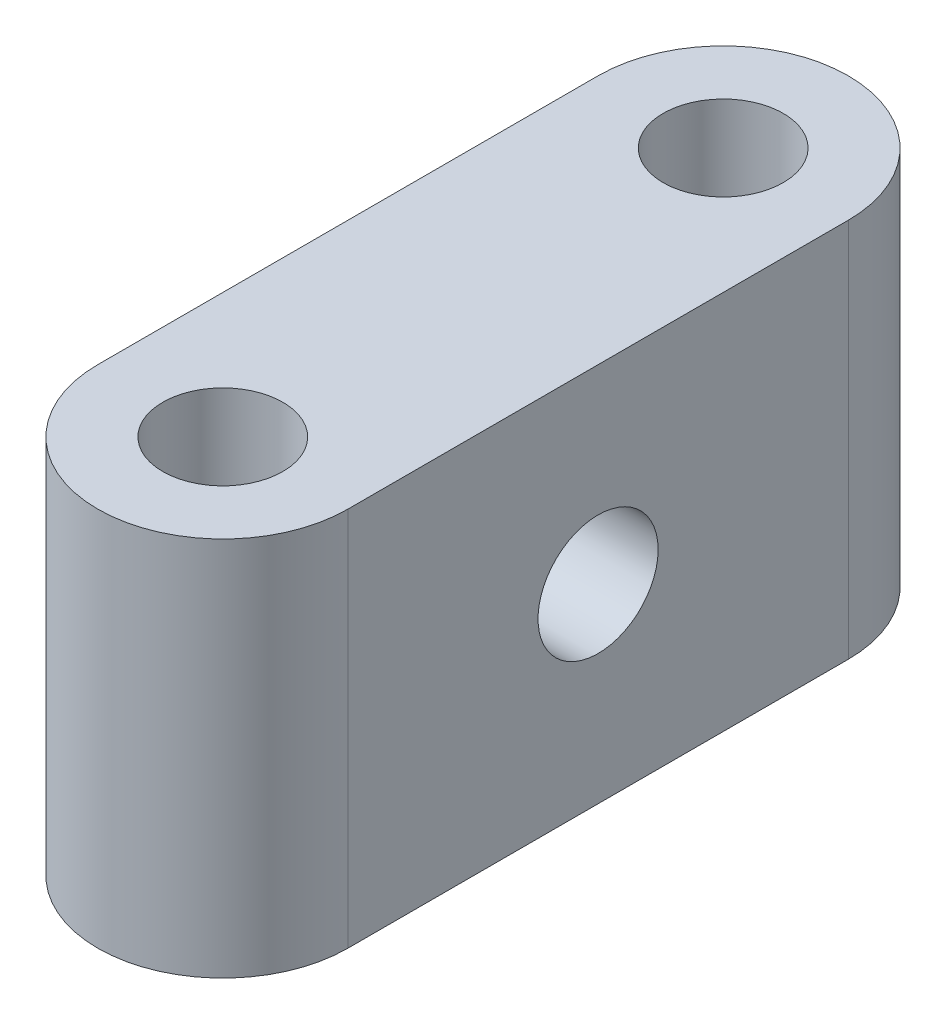
ISO-10303-21;
HEADER;
FILE_DESCRIPTION(('STEP AP214'),'2;1');
FILE_NAME('part.step','',(''),(''),'','','');
FILE_SCHEMA(('AUTOMOTIVE_DESIGN { 1 0 10303 214 1 1 1 1 }'));
ENDSEC;
DATA;
#1=APPLICATION_CONTEXT('core data for automotive mechanical design processes');
#2=APPLICATION_PROTOCOL_DEFINITION('international standard','automotive_design',2000,#1);
#3=PRODUCT_CONTEXT('',#1,'mechanical');
#4=PRODUCT('Part','Part','',(#3));
#5=PRODUCT_RELATED_PRODUCT_CATEGORY('part','',(#4));
#6=PRODUCT_DEFINITION_FORMATION('','',#4);
#7=PRODUCT_DEFINITION_CONTEXT('part definition',#1,'design');
#8=PRODUCT_DEFINITION('design','',#6,#7);
#9=PRODUCT_DEFINITION_SHAPE('','',#8);
#10=(LENGTH_UNIT() NAMED_UNIT(*) SI_UNIT(.MILLI.,.METRE.));
#11=(NAMED_UNIT(*) PLANE_ANGLE_UNIT() SI_UNIT($,.RADIAN.));
#12=(NAMED_UNIT(*) SI_UNIT($,.STERADIAN.) SOLID_ANGLE_UNIT());
#13=UNCERTAINTY_MEASURE_WITH_UNIT(LENGTH_MEASURE(1.E-05),#10,'distance_accuracy_value','');
#14=(GEOMETRIC_REPRESENTATION_CONTEXT(3) GLOBAL_UNCERTAINTY_ASSIGNED_CONTEXT((#13)) GLOBAL_UNIT_ASSIGNED_CONTEXT((#10,
#11,#12)) REPRESENTATION_CONTEXT('',''));
#15=CARTESIAN_POINT('',(0.,0.,0.));
#16=DIRECTION('',(0.,0.,1.));
#17=DIRECTION('',(1.,0.,0.));
#18=AXIS2_PLACEMENT_3D('',#15,#16,#17);
#19=CARTESIAN_POINT('',(0.,19.,25.));
#20=DIRECTION('',(0.,1.,0.));
#21=DIRECTION('',(0.,0.,1.));
#22=AXIS2_PLACEMENT_3D('',#19,#20,#21);
#23=PLANE('',#22);
#24=CARTESIAN_POINT('',(0.,19.,-25.));
#25=DIRECTION('',(0.,1.,0.));
#26=DIRECTION('',(0.,0.,1.));
#27=AXIS2_PLACEMENT_3D('',#24,#25,#26);
#28=CIRCLE('',#27,6.);
#29=CARTESIAN_POINT('',(0.,19.,-19.));
#30=VERTEX_POINT('',#29);
#31=EDGE_CURVE('E106',#30,#30,#28,.T.);
#32=ORIENTED_EDGE('',*,*,#31,.F.);
#33=EDGE_LOOP('',(#32));
#34=FACE_BOUND('',#33,.T.);
#35=CARTESIAN_POINT('',(0.,19.,25.));
#36=DIRECTION('',(0.,1.,0.));
#37=DIRECTION('',(0.,0.,1.));
#38=AXIS2_PLACEMENT_3D('',#35,#36,#37);
#39=CIRCLE('',#38,12.5);
#40=CARTESIAN_POINT('',(-12.5,19.,25.));
#41=VERTEX_POINT('',#40);
#42=CARTESIAN_POINT('',(12.5,19.,25.));
#43=VERTEX_POINT('',#42);
#44=EDGE_CURVE('E91',#41,#43,#39,.T.);
#45=ORIENTED_EDGE('',*,*,#44,.T.);
#46=DIRECTION('',(0.,0.,-1.));
#47=VECTOR('',#46,1.);
#48=CARTESIAN_POINT('',(12.5,19.,25.));
#49=LINE('',#48,#47);
#50=CARTESIAN_POINT('',(12.5,19.,-25.));
#51=VERTEX_POINT('',#50);
#52=EDGE_CURVE('E86',#43,#51,#49,.T.);
#53=ORIENTED_EDGE('',*,*,#52,.T.);
#54=CARTESIAN_POINT('',(0.,19.,-25.));
#55=DIRECTION('',(0.,1.,0.));
#56=DIRECTION('',(0.,0.,1.));
#57=AXIS2_PLACEMENT_3D('',#54,#55,#56);
#58=CIRCLE('',#57,12.5);
#59=CARTESIAN_POINT('',(-12.5,19.,-25.));
#60=VERTEX_POINT('',#59);
#61=EDGE_CURVE('E89',#51,#60,#58,.T.);
#62=ORIENTED_EDGE('',*,*,#61,.T.);
#63=DIRECTION('',(0.,0.,1.));
#64=VECTOR('',#63,1.);
#65=CARTESIAN_POINT('',(-12.5,19.,25.));
#66=LINE('',#65,#64);
#67=EDGE_CURVE('E56',#60,#41,#66,.T.);
#68=ORIENTED_EDGE('',*,*,#67,.T.);
#69=EDGE_LOOP('',(#45,#53,#62,#68));
#70=FACE_BOUND('',#69,.T.);
#71=CARTESIAN_POINT('',(0.,19.,25.));
#72=DIRECTION('',(0.,1.,0.));
#73=DIRECTION('',(0.,0.,1.));
#74=AXIS2_PLACEMENT_3D('',#71,#72,#73);
#75=CIRCLE('',#74,6.);
#76=CARTESIAN_POINT('',(0.,19.,31.));
#77=VERTEX_POINT('',#76);
#78=EDGE_CURVE('E121',#77,#77,#75,.T.);
#79=ORIENTED_EDGE('',*,*,#78,.F.);
#80=EDGE_LOOP('',(#79));
#81=FACE_BOUND('',#80,.T.);
#82=ADVANCED_FACE('F39',(#34,#70,#81),#23,.T.);
#83=CARTESIAN_POINT('',(0.,-19.,25.));
#84=DIRECTION('',(0.,1.,0.));
#85=DIRECTION('',(0.,0.,1.));
#86=AXIS2_PLACEMENT_3D('',#83,#84,#85);
#87=PLANE('',#86);
#88=CARTESIAN_POINT('',(0.,-19.,25.));
#89=DIRECTION('',(0.,1.,0.));
#90=DIRECTION('',(0.,0.,1.));
#91=AXIS2_PLACEMENT_3D('',#88,#89,#90);
#92=CIRCLE('',#91,12.5);
#93=CARTESIAN_POINT('',(-12.5,-19.,25.));
#94=VERTEX_POINT('',#93);
#95=CARTESIAN_POINT('',(12.5,-19.,25.));
#96=VERTEX_POINT('',#95);
#97=EDGE_CURVE('E103',#94,#96,#92,.T.);
#98=ORIENTED_EDGE('',*,*,#97,.F.);
#99=DIRECTION('',(0.,0.,1.));
#100=VECTOR('',#99,1.);
#101=CARTESIAN_POINT('',(-12.5,-19.,25.));
#102=LINE('',#101,#100);
#103=CARTESIAN_POINT('',(-12.5,-19.,-25.));
#104=VERTEX_POINT('',#103);
#105=EDGE_CURVE('E79',#104,#94,#102,.T.);
#106=ORIENTED_EDGE('',*,*,#105,.F.);
#107=CARTESIAN_POINT('',(0.,-19.,-25.));
#108=DIRECTION('',(0.,1.,0.));
#109=DIRECTION('',(0.,0.,1.));
#110=AXIS2_PLACEMENT_3D('',#107,#108,#109);
#111=CIRCLE('',#110,12.5);
#112=CARTESIAN_POINT('',(12.5,-19.,-25.));
#113=VERTEX_POINT('',#112);
#114=EDGE_CURVE('E73',#113,#104,#111,.T.);
#115=ORIENTED_EDGE('',*,*,#114,.F.);
#116=DIRECTION('',(0.,0.,-1.));
#117=VECTOR('',#116,1.);
#118=CARTESIAN_POINT('',(12.5,-19.,25.));
#119=LINE('',#118,#117);
#120=EDGE_CURVE('E95',#96,#113,#119,.T.);
#121=ORIENTED_EDGE('',*,*,#120,.F.);
#122=EDGE_LOOP('',(#98,#106,#115,#121));
#123=FACE_BOUND('',#122,.T.);
#124=CARTESIAN_POINT('',(0.,-19.,-25.));
#125=DIRECTION('',(0.,1.,0.));
#126=DIRECTION('',(0.,0.,1.));
#127=AXIS2_PLACEMENT_3D('',#124,#125,#126);
#128=CIRCLE('',#127,6.);
#129=CARTESIAN_POINT('',(0.,-19.,-19.));
#130=VERTEX_POINT('',#129);
#131=EDGE_CURVE('E118',#130,#130,#128,.T.);
#132=ORIENTED_EDGE('',*,*,#131,.T.);
#133=EDGE_LOOP('',(#132));
#134=FACE_BOUND('',#133,.T.);
#135=CARTESIAN_POINT('',(0.,-19.,25.));
#136=DIRECTION('',(0.,1.,0.));
#137=DIRECTION('',(0.,0.,1.));
#138=AXIS2_PLACEMENT_3D('',#135,#136,#137);
#139=CIRCLE('',#138,6.);
#140=CARTESIAN_POINT('',(0.,-19.,31.));
#141=VERTEX_POINT('',#140);
#142=EDGE_CURVE('E124',#141,#141,#139,.T.);
#143=ORIENTED_EDGE('',*,*,#142,.T.);
#144=EDGE_LOOP('',(#143));
#145=FACE_BOUND('',#144,.T.);
#146=ADVANCED_FACE('F114',(#123,#134,#145),#87,.F.);
#147=CARTESIAN_POINT('',(0.,19.,25.));
#148=DIRECTION('',(0.,-1.,0.));
#149=DIRECTION('',(0.,0.,-1.));
#150=AXIS2_PLACEMENT_3D('',#147,#148,#149);
#151=CYLINDRICAL_SURFACE('',#150,12.5);
#152=ORIENTED_EDGE('',*,*,#97,.T.);
#153=DIRECTION('',(0.,-1.,0.));
#154=VECTOR('',#153,1.);
#155=CARTESIAN_POINT('',(12.5,19.,25.));
#156=LINE('',#155,#154);
#157=EDGE_CURVE('E11',#43,#96,#156,.T.);
#158=ORIENTED_EDGE('',*,*,#157,.F.);
#159=ORIENTED_EDGE('',*,*,#44,.F.);
#160=DIRECTION('',(0.,-1.,0.));
#161=VECTOR('',#160,1.);
#162=CARTESIAN_POINT('',(-12.5,19.,25.));
#163=LINE('',#162,#161);
#164=EDGE_CURVE('E99',#41,#94,#163,.T.);
#165=ORIENTED_EDGE('',*,*,#164,.T.);
#166=EDGE_LOOP('',(#152,#158,#159,#165));
#167=FACE_BOUND('',#166,.T.);
#168=ADVANCED_FACE('F41',(#167),#151,.T.);
#169=CARTESIAN_POINT('',(12.5,19.,25.));
#170=DIRECTION('',(-1.,0.,0.));
#171=DIRECTION('',(0.,0.,1.));
#172=AXIS2_PLACEMENT_3D('',#169,#170,#171);
#173=PLANE('',#172);
#174=CARTESIAN_POINT('',(12.5,0.,0.));
#175=DIRECTION('',(1.,0.,0.));
#176=DIRECTION('',(0.,0.,-1.));
#177=AXIS2_PLACEMENT_3D('',#174,#175,#176);
#178=CIRCLE('',#177,6.);
#179=CARTESIAN_POINT('',(12.5,0.,-6.));
#180=VERTEX_POINT('',#179);
#181=EDGE_CURVE('E130',#180,#180,#178,.T.);
#182=ORIENTED_EDGE('',*,*,#181,.F.);
#183=EDGE_LOOP('',(#182));
#184=FACE_BOUND('',#183,.T.);
#185=ORIENTED_EDGE('',*,*,#120,.T.);
#186=DIRECTION('',(0.,-1.,0.));
#187=VECTOR('',#186,1.);
#188=CARTESIAN_POINT('',(12.5,19.,-25.));
#189=LINE('',#188,#187);
#190=EDGE_CURVE('E48',#51,#113,#189,.T.);
#191=ORIENTED_EDGE('',*,*,#190,.F.);
#192=ORIENTED_EDGE('',*,*,#52,.F.);
#193=ORIENTED_EDGE('',*,*,#157,.T.);
#194=EDGE_LOOP('',(#185,#191,#192,#193));
#195=FACE_BOUND('',#194,.T.);
#196=ADVANCED_FACE('F94',(#184,#195),#173,.F.);
#197=CARTESIAN_POINT('',(0.,19.,-25.));
#198=DIRECTION('',(0.,-1.,0.));
#199=DIRECTION('',(0.,0.,-1.));
#200=AXIS2_PLACEMENT_3D('',#197,#198,#199);
#201=CYLINDRICAL_SURFACE('',#200,12.5);
#202=ORIENTED_EDGE('',*,*,#114,.T.);
#203=DIRECTION('',(0.,-1.,0.));
#204=VECTOR('',#203,1.);
#205=CARTESIAN_POINT('',(-12.5,19.,-25.));
#206=LINE('',#205,#204);
#207=EDGE_CURVE('E96',#60,#104,#206,.T.);
#208=ORIENTED_EDGE('',*,*,#207,.F.);
#209=ORIENTED_EDGE('',*,*,#61,.F.);
#210=ORIENTED_EDGE('',*,*,#190,.T.);
#211=EDGE_LOOP('',(#202,#208,#209,#210));
#212=FACE_BOUND('',#211,.T.);
#213=ADVANCED_FACE('F97',(#212),#201,.T.);
#214=CARTESIAN_POINT('',(-12.5,19.,25.));
#215=DIRECTION('',(1.,0.,0.));
#216=DIRECTION('',(0.,0.,-1.));
#217=AXIS2_PLACEMENT_3D('',#214,#215,#216);
#218=PLANE('',#217);
#219=ORIENTED_EDGE('',*,*,#105,.T.);
#220=ORIENTED_EDGE('',*,*,#164,.F.);
#221=ORIENTED_EDGE('',*,*,#67,.F.);
#222=ORIENTED_EDGE('',*,*,#207,.T.);
#223=EDGE_LOOP('',(#219,#220,#221,#222));
#224=FACE_BOUND('',#223,.T.);
#225=ADVANCED_FACE('F111',(#224),#218,.F.);
#226=CARTESIAN_POINT('',(0.,19.,-25.));
#227=DIRECTION('',(0.,-1.,0.));
#228=DIRECTION('',(0.,0.,-1.));
#229=AXIS2_PLACEMENT_3D('',#226,#227,#228);
#230=CYLINDRICAL_SURFACE('',#229,6.);
#231=ORIENTED_EDGE('',*,*,#31,.T.);
#232=EDGE_LOOP('',(#231));
#233=FACE_BOUND('',#232,.T.);
#234=ORIENTED_EDGE('',*,*,#131,.F.);
#235=EDGE_LOOP('',(#234));
#236=FACE_BOUND('',#235,.T.);
#237=ADVANCED_FACE('F161',(#233,#236),#230,.F.);
#238=CARTESIAN_POINT('',(0.,19.,25.));
#239=DIRECTION('',(0.,-1.,0.));
#240=DIRECTION('',(0.,0.,-1.));
#241=AXIS2_PLACEMENT_3D('',#238,#239,#240);
#242=CYLINDRICAL_SURFACE('',#241,6.);
#243=ORIENTED_EDGE('',*,*,#78,.T.);
#244=EDGE_LOOP('',(#243));
#245=FACE_BOUND('',#244,.T.);
#246=ORIENTED_EDGE('',*,*,#142,.F.);
#247=EDGE_LOOP('',(#246));
#248=FACE_BOUND('',#247,.T.);
#249=ADVANCED_FACE('F141',(#245,#248),#242,.F.);
#250=CARTESIAN_POINT('',(0.,0.,0.));
#251=DIRECTION('',(1.,0.,0.));
#252=DIRECTION('',(0.,0.,-1.));
#253=AXIS2_PLACEMENT_3D('',#250,#251,#252);
#254=CYLINDRICAL_SURFACE('',#253,6.);
#255=CARTESIAN_POINT('',(0.,0.,0.));
#256=DIRECTION('',(1.,0.,0.));
#257=DIRECTION('',(0.,0.,-1.));
#258=AXIS2_PLACEMENT_3D('',#255,#256,#257);
#259=CIRCLE('',#258,6.);
#260=CARTESIAN_POINT('',(0.,0.,-6.));
#261=VERTEX_POINT('',#260);
#262=EDGE_CURVE('E127',#261,#261,#259,.T.);
#263=ORIENTED_EDGE('',*,*,#262,.F.);
#264=EDGE_LOOP('',(#263));
#265=FACE_BOUND('',#264,.T.);
#266=ORIENTED_EDGE('',*,*,#181,.T.);
#267=EDGE_LOOP('',(#266));
#268=FACE_BOUND('',#267,.T.);
#269=ADVANCED_FACE('F138',(#265,#268),#254,.F.);
#270=CARTESIAN_POINT('',(0.,0.,0.));
#271=DIRECTION('',(1.,0.,0.));
#272=DIRECTION('',(0.,0.,-1.));
#273=AXIS2_PLACEMENT_3D('',#270,#271,#272);
#274=PLANE('',#273);
#275=ORIENTED_EDGE('',*,*,#262,.T.);
#276=EDGE_LOOP('',(#275));
#277=FACE_BOUND('',#276,.T.);
#278=ADVANCED_FACE('F136',(#277),#274,.T.);
#279=CLOSED_SHELL('',(#82,#146,#168,#196,#213,#225,#237,#249,#269,#278));
#280=MANIFOLD_SOLID_BREP('B2',#279);
#281=ADVANCED_BREP_SHAPE_REPRESENTATION('',(#18,#280),#14);
#282=SHAPE_DEFINITION_REPRESENTATION(#9,#281);
ENDSEC;
END-ISO-10303-21;
